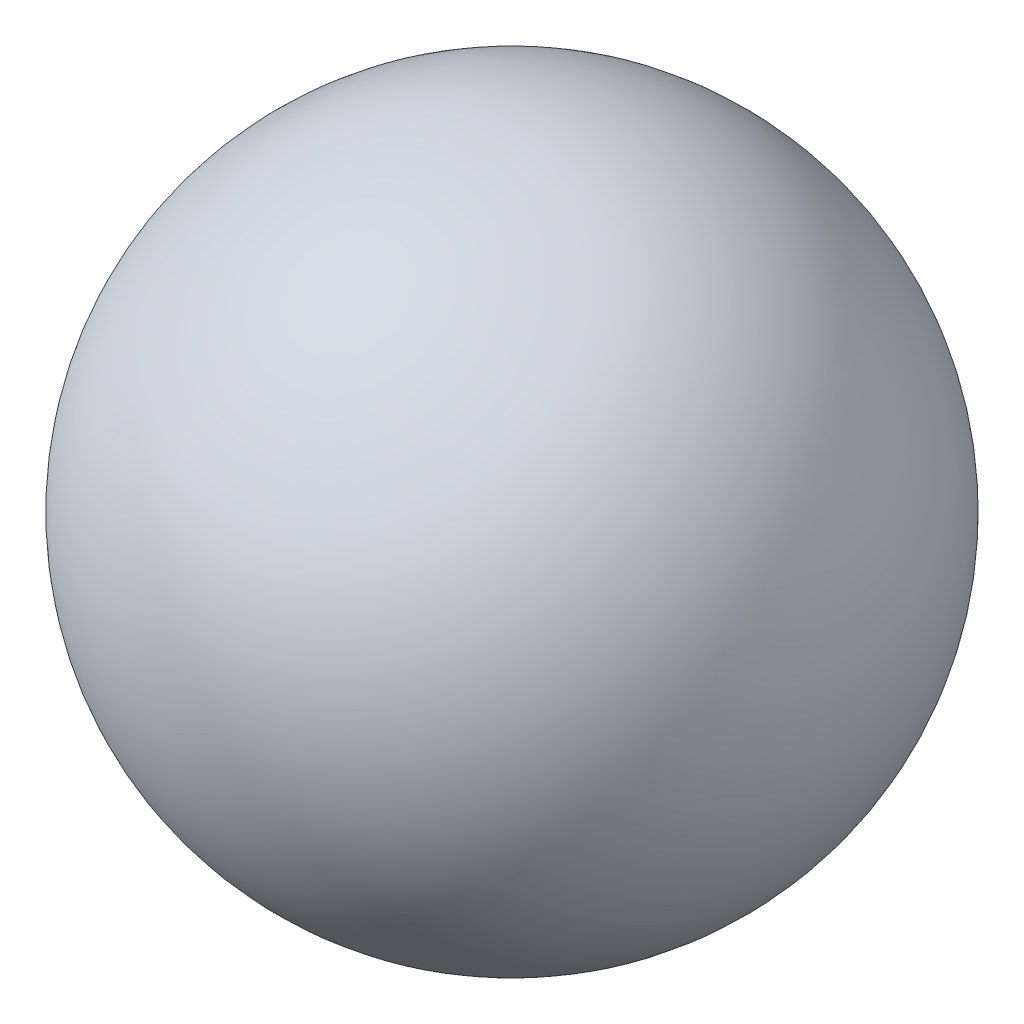
ISO-10303-21;
HEADER;
FILE_DESCRIPTION(('STEP AP214'),'2;1');
FILE_NAME('part.step','',(''),(''),'','','');
FILE_SCHEMA(('AUTOMOTIVE_DESIGN { 1 0 10303 214 1 1 1 1 }'));
ENDSEC;
DATA;
#1=APPLICATION_CONTEXT('core data for automotive mechanical design processes');
#2=APPLICATION_PROTOCOL_DEFINITION('international standard','automotive_design',2000,#1);
#3=PRODUCT_CONTEXT('',#1,'mechanical');
#4=PRODUCT('Part','Part','',(#3));
#5=PRODUCT_RELATED_PRODUCT_CATEGORY('part','',(#4));
#6=PRODUCT_DEFINITION_FORMATION('','',#4);
#7=PRODUCT_DEFINITION_CONTEXT('part definition',#1,'design');
#8=PRODUCT_DEFINITION('design','',#6,#7);
#9=PRODUCT_DEFINITION_SHAPE('','',#8);
#10=(LENGTH_UNIT() NAMED_UNIT(*) SI_UNIT(.MILLI.,.METRE.));
#11=(NAMED_UNIT(*) PLANE_ANGLE_UNIT() SI_UNIT($,.RADIAN.));
#12=(NAMED_UNIT(*) SI_UNIT($,.STERADIAN.) SOLID_ANGLE_UNIT());
#13=UNCERTAINTY_MEASURE_WITH_UNIT(LENGTH_MEASURE(1.E-05),#10,'distance_accuracy_value','');
#14=(GEOMETRIC_REPRESENTATION_CONTEXT(3) GLOBAL_UNCERTAINTY_ASSIGNED_CONTEXT((#13)) GLOBAL_UNIT_ASSIGNED_CONTEXT((#10,
#11,#12)) REPRESENTATION_CONTEXT('',''));
#15=CARTESIAN_POINT('',(0.,0.,0.));
#16=DIRECTION('',(0.,0.,1.));
#17=DIRECTION('',(1.,0.,0.));
#18=AXIS2_PLACEMENT_3D('',#15,#16,#17);
#19=CARTESIAN_POINT('',(0.,0.,0.));
#20=DIRECTION('',(0.,-1.,0.));
#21=DIRECTION('',(-1.,0.,0.));
#22=AXIS2_PLACEMENT_3D('',#19,#20,#21);
#23=SPHERICAL_SURFACE('',#22,420.);
#24=CARTESIAN_POINT('',(0.,-420.,0.));
#25=VERTEX_POINT('',#24);
#26=VERTEX_LOOP('',#25);
#27=FACE_BOUND('',#26,.T.);
#28=ADVANCED_FACE('F35',(#27),#23,.T.);
#29=CLOSED_SHELL('',(#28));
#30=CARTESIAN_POINT('',(0.,0.,0.));
#31=DIRECTION('',(0.,-1.,0.));
#32=DIRECTION('',(-1.,0.,0.));
#33=AXIS2_PLACEMENT_3D('',#30,#31,#32);
#34=SPHERICAL_SURFACE('',#33,416.14);
#35=CARTESIAN_POINT('',(0.,-416.14,0.));
#36=VERTEX_POINT('',#35);
#37=VERTEX_LOOP('',#36);
#38=FACE_BOUND('',#37,.T.);
#39=ADVANCED_FACE('F47',(#38),#34,.F.);
#40=CLOSED_SHELL('',(#39));
#41=ORIENTED_CLOSED_SHELL('',*,#40,.T.);
#42=BREP_WITH_VOIDS('B2',#29,(#41));
#43=ADVANCED_BREP_SHAPE_REPRESENTATION('',(#18,#42),#14);
#44=SHAPE_DEFINITION_REPRESENTATION(#9,#43);
ENDSEC;
END-ISO-10303-21;
